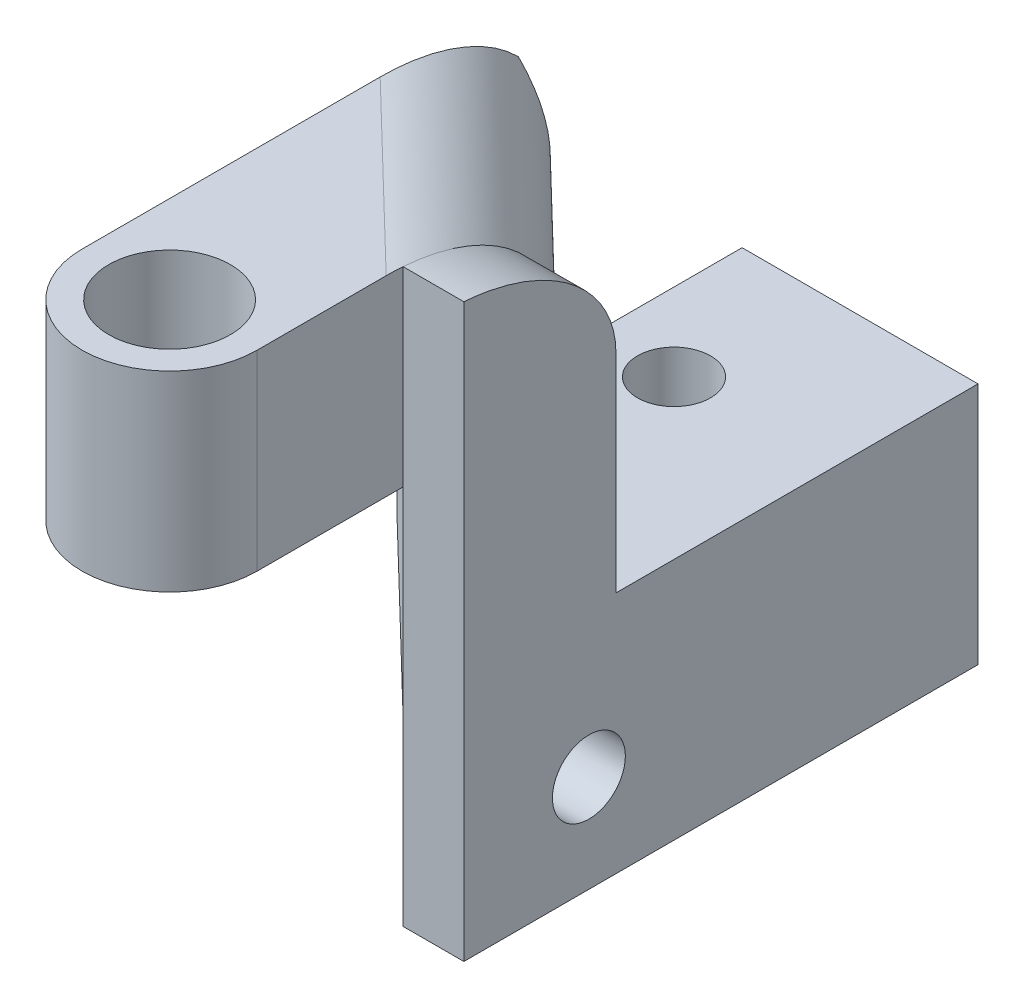
ISO-10303-21;
HEADER;
FILE_DESCRIPTION(('STEP AP214'),'2;1');
FILE_NAME('part.step','',(''),(''),'','','');
FILE_SCHEMA(('AUTOMOTIVE_DESIGN { 1 0 10303 214 1 1 1 1 }'));
ENDSEC;
DATA;
#1=APPLICATION_CONTEXT('core data for automotive mechanical design processes');
#2=APPLICATION_PROTOCOL_DEFINITION('international standard','automotive_design',2000,#1);
#3=PRODUCT_CONTEXT('',#1,'mechanical');
#4=PRODUCT('Part','Part','',(#3));
#5=PRODUCT_RELATED_PRODUCT_CATEGORY('part','',(#4));
#6=PRODUCT_DEFINITION_FORMATION('','',#4);
#7=PRODUCT_DEFINITION_CONTEXT('part definition',#1,'design');
#8=PRODUCT_DEFINITION('design','',#6,#7);
#9=PRODUCT_DEFINITION_SHAPE('','',#8);
#10=(LENGTH_UNIT() NAMED_UNIT(*) SI_UNIT(.MILLI.,.METRE.));
#11=(NAMED_UNIT(*) PLANE_ANGLE_UNIT() SI_UNIT($,.RADIAN.));
#12=(NAMED_UNIT(*) SI_UNIT($,.STERADIAN.) SOLID_ANGLE_UNIT());
#13=UNCERTAINTY_MEASURE_WITH_UNIT(LENGTH_MEASURE(1.E-05),#10,'distance_accuracy_value','');
#14=(GEOMETRIC_REPRESENTATION_CONTEXT(3) GLOBAL_UNCERTAINTY_ASSIGNED_CONTEXT((#13)) GLOBAL_UNIT_ASSIGNED_CONTEXT((#10,
#11,#12)) REPRESENTATION_CONTEXT('',''));
#15=CARTESIAN_POINT('',(0.,0.,0.));
#16=DIRECTION('',(0.,0.,1.));
#17=DIRECTION('',(1.,0.,0.));
#18=AXIS2_PLACEMENT_3D('',#15,#16,#17);
#19=CARTESIAN_POINT('',(4.73535338699276,2.5,-4.9036019787419));
#20=DIRECTION('',(0.694658370458993,0.,-0.719339800338655));
#21=DIRECTION('',(-0.719339800338655,0.,-0.694658370458993));
#22=AXIS2_PLACEMENT_3D('',#19,#20,#21);
#23=PLANE('',#22);
#24=DIRECTION('',(0.719339800338655,0.,0.694658370458993));
#25=VECTOR('',#24,1.);
#26=CARTESIAN_POINT('',(4.73535338699276,8.15,-4.9036019787419));
#27=LINE('',#26,#25);
#28=CARTESIAN_POINT('',(-3.6,8.15,-12.9529591786108));
#29=VERTEX_POINT('',#28);
#30=CARTESIAN_POINT('',(3.59999999999999,8.15,-6.));
#31=VERTEX_POINT('',#30);
#32=EDGE_CURVE('E182',#29,#31,#27,.T.);
#33=ORIENTED_EDGE('',*,*,#32,.F.);
#34=DIRECTION('',(0.,-1.,0.));
#35=VECTOR('',#34,1.);
#36=CARTESIAN_POINT('',(-3.6,2.5,-12.9529591786108));
#37=LINE('',#36,#35);
#38=CARTESIAN_POINT('',(-3.6,0.,-12.9529591786108));
#39=VERTEX_POINT('',#38);
#40=EDGE_CURVE('E232',#29,#39,#37,.T.);
#41=ORIENTED_EDGE('',*,*,#40,.T.);
#42=DIRECTION('',(0.719339800338655,0.,0.694658370458993));
#43=VECTOR('',#42,1.);
#44=CARTESIAN_POINT('',(4.73535338699276,0.,-4.9036019787419));
#45=LINE('',#44,#43);
#46=CARTESIAN_POINT('',(3.59999999999999,0.,-6.));
#47=VERTEX_POINT('',#46);
#48=EDGE_CURVE('E226',#39,#47,#45,.T.);
#49=ORIENTED_EDGE('',*,*,#48,.T.);
#50=DIRECTION('',(0.,-1.,0.));
#51=VECTOR('',#50,1.);
#52=CARTESIAN_POINT('',(3.59999999999999,2.5,-6.));
#53=LINE('',#52,#51);
#54=EDGE_CURVE('E216',#31,#47,#53,.T.);
#55=ORIENTED_EDGE('',*,*,#54,.F.);
#56=EDGE_LOOP('',(#33,#41,#49,#55));
#57=FACE_BOUND('',#56,.T.);
#58=ADVANCED_FACE('F41',(#57),#23,.F.);
#59=CARTESIAN_POINT('',(3.59999999999999,2.5,0.));
#60=DIRECTION('',(-1.,0.,0.));
#61=DIRECTION('',(0.,0.,1.));
#62=AXIS2_PLACEMENT_3D('',#59,#60,#61);
#63=PLANE('',#62);
#64=DIRECTION('',(0.,-1.,0.));
#65=VECTOR('',#64,1.);
#66=CARTESIAN_POINT('',(3.59999999999999,0.,-6.));
#67=LINE('',#66,#65);
#68=CARTESIAN_POINT('',(3.59999999999999,15.9949371855331,-6.));
#69=VERTEX_POINT('',#68);
#70=EDGE_CURVE('E57',#69,#31,#67,.T.);
#71=ORIENTED_EDGE('',*,*,#70,.F.);
#72=CARTESIAN_POINT('',(3.59999999999999,11.02,-5.30491820449167));
#73=DIRECTION('',(-1.,0.,0.));
#74=DIRECTION('',(0.,0.,1.));
#75=AXIS2_PLACEMENT_3D('',#72,#73,#74);
#76=ELLIPSE('',#75,6.95081795508336,5.);
#77=CARTESIAN_POINT('',(3.59999999999999,16.02,-5.30491820449167));
#78=VERTEX_POINT('',#77);
#79=EDGE_CURVE('E248',#69,#78,#76,.F.);
#80=ORIENTED_EDGE('',*,*,#79,.T.);
#81=DIRECTION('',(0.,0.,-1.));
#82=VECTOR('',#81,1.);
#83=CARTESIAN_POINT('',(3.59999999999999,16.02,0.));
#84=LINE('',#83,#82);
#85=CARTESIAN_POINT('',(3.59999999999999,16.02,0.));
#86=VERTEX_POINT('',#85);
#87=EDGE_CURVE('E202',#86,#78,#84,.T.);
#88=ORIENTED_EDGE('',*,*,#87,.F.);
#89=DIRECTION('',(0.,-1.,0.));
#90=VECTOR('',#89,1.);
#91=CARTESIAN_POINT('',(3.59999999999999,16.02,0.));
#92=LINE('',#91,#90);
#93=CARTESIAN_POINT('',(3.59999999999999,8.15,0.));
#94=VERTEX_POINT('',#93);
#95=EDGE_CURVE('E184',#86,#94,#92,.T.);
#96=ORIENTED_EDGE('',*,*,#95,.T.);
#97=DIRECTION('',(0.,0.,-1.));
#98=VECTOR('',#97,1.);
#99=CARTESIAN_POINT('',(3.59999999999999,8.15,0.));
#100=LINE('',#99,#98);
#101=EDGE_CURVE('E191',#94,#31,#100,.T.);
#102=ORIENTED_EDGE('',*,*,#101,.T.);
#103=EDGE_LOOP('',(#71,#80,#88,#96,#102));
#104=FACE_BOUND('',#103,.T.);
#105=ADVANCED_FACE('F360',(#104),#63,.F.);
#106=CARTESIAN_POINT('',(0.,2.5,-27.14));
#107=DIRECTION('',(0.,0.,1.));
#108=DIRECTION('',(1.,0.,0.));
#109=AXIS2_PLACEMENT_3D('',#106,#107,#108);
#110=PLANE('',#109);
#111=DIRECTION('',(-1.,0.,0.));
#112=VECTOR('',#111,1.);
#113=CARTESIAN_POINT('',(0.,0.,-27.14));
#114=LINE('',#113,#112);
#115=CARTESIAN_POINT('',(3.59999999999999,0.,-27.14));
#116=VERTEX_POINT('',#115);
#117=CARTESIAN_POINT('',(-3.6,0.,-27.14));
#118=VERTEX_POINT('',#117);
#119=EDGE_CURVE('E222',#116,#118,#114,.T.);
#120=ORIENTED_EDGE('',*,*,#119,.T.);
#121=DIRECTION('',(0.,-1.,0.));
#122=VECTOR('',#121,1.);
#123=CARTESIAN_POINT('',(-3.6,2.5,-27.14));
#124=LINE('',#123,#122);
#125=CARTESIAN_POINT('',(-3.6,2.5,-27.14));
#126=VERTEX_POINT('',#125);
#127=EDGE_CURVE('E240',#126,#118,#124,.T.);
#128=ORIENTED_EDGE('',*,*,#127,.F.);
#129=DIRECTION('',(-1.,0.,0.));
#130=VECTOR('',#129,1.);
#131=CARTESIAN_POINT('',(0.,2.5,-27.14));
#132=LINE('',#131,#130);
#133=CARTESIAN_POINT('',(6.09999999999999,2.5,-27.14));
#134=VERTEX_POINT('',#133);
#135=EDGE_CURVE('E149',#134,#126,#132,.T.);
#136=ORIENTED_EDGE('',*,*,#135,.F.);
#137=DIRECTION('',(0.,1.,0.));
#138=VECTOR('',#137,1.);
#139=CARTESIAN_POINT('',(6.09999999999999,0.,-27.14));
#140=LINE('',#139,#138);
#141=CARTESIAN_POINT('',(6.09999999999999,-7.5,-27.14));
#142=VERTEX_POINT('',#141);
#143=EDGE_CURVE('E145',#142,#134,#140,.T.);
#144=ORIENTED_EDGE('',*,*,#143,.F.);
#145=DIRECTION('',(-1.,0.,0.));
#146=VECTOR('',#145,1.);
#147=CARTESIAN_POINT('',(6.09999999999999,-7.5,-27.14));
#148=LINE('',#147,#146);
#149=CARTESIAN_POINT('',(3.59999999999999,-7.5,-27.14));
#150=VERTEX_POINT('',#149);
#151=EDGE_CURVE('E150',#142,#150,#148,.T.);
#152=ORIENTED_EDGE('',*,*,#151,.T.);
#153=DIRECTION('',(0.,1.,0.));
#154=VECTOR('',#153,1.);
#155=CARTESIAN_POINT('',(3.59999999999999,0.,-27.14));
#156=LINE('',#155,#154);
#157=EDGE_CURVE('E290',#150,#116,#156,.T.);
#158=ORIENTED_EDGE('',*,*,#157,.T.);
#159=EDGE_LOOP('',(#120,#128,#136,#144,#152,#158));
#160=FACE_BOUND('',#159,.T.);
#161=ADVANCED_FACE('F144',(#160),#110,.F.);
#162=CARTESIAN_POINT('',(-3.59999999999999,2.5,0.));
#163=DIRECTION('',(1.,0.,0.));
#164=DIRECTION('',(0.,0.,-1.));
#165=AXIS2_PLACEMENT_3D('',#162,#163,#164);
#166=PLANE('',#165);
#167=DIRECTION('',(0.,0.,1.));
#168=VECTOR('',#167,1.);
#169=CARTESIAN_POINT('',(-3.59999999999999,16.02,0.));
#170=LINE('',#169,#168);
#171=CARTESIAN_POINT('',(-3.59999999999999,16.02,-12.2578773831025));
#172=VERTEX_POINT('',#171);
#173=CARTESIAN_POINT('',(-3.59999999999999,16.02,0.));
#174=VERTEX_POINT('',#173);
#175=EDGE_CURVE('E203',#172,#174,#170,.T.);
#176=ORIENTED_EDGE('',*,*,#175,.F.);
#177=CARTESIAN_POINT('',(-3.59999999999999,11.02,-12.2578773831025));
#178=DIRECTION('',(1.,0.,0.));
#179=DIRECTION('',(0.,0.,1.));
#180=AXIS2_PLACEMENT_3D('',#177,#178,#179);
#181=ELLIPSE('',#180,6.95081795508336,5.);
#182=CARTESIAN_POINT('',(-3.59999999999999,13.899817646817,-17.94));
#183=VERTEX_POINT('',#182);
#184=EDGE_CURVE('E47',#172,#183,#181,.F.);
#185=ORIENTED_EDGE('',*,*,#184,.T.);
#186=DIRECTION('',(0.,-1.,0.));
#187=VECTOR('',#186,1.);
#188=CARTESIAN_POINT('',(-3.59999999999999,29.9628691451939,-17.94));
#189=LINE('',#188,#187);
#190=CARTESIAN_POINT('',(-3.59999999999999,2.5,-17.94));
#191=VERTEX_POINT('',#190);
#192=EDGE_CURVE('E205',#183,#191,#189,.T.);
#193=ORIENTED_EDGE('',*,*,#192,.T.);
#194=DIRECTION('',(0.,0.,1.));
#195=VECTOR('',#194,1.);
#196=CARTESIAN_POINT('',(-3.59999999999999,2.5,0.));
#197=LINE('',#196,#195);
#198=EDGE_CURVE('E212',#126,#191,#197,.T.);
#199=ORIENTED_EDGE('',*,*,#198,.F.);
#200=ORIENTED_EDGE('',*,*,#127,.T.);
#201=DIRECTION('',(0.,0.,1.));
#202=VECTOR('',#201,1.);
#203=CARTESIAN_POINT('',(-3.59999999999999,0.,0.));
#204=LINE('',#203,#202);
#205=EDGE_CURVE('E221',#118,#39,#204,.T.);
#206=ORIENTED_EDGE('',*,*,#205,.T.);
#207=ORIENTED_EDGE('',*,*,#40,.F.);
#208=DIRECTION('',(0.,0.,1.));
#209=VECTOR('',#208,1.);
#210=CARTESIAN_POINT('',(-3.59999999999999,8.15,0.));
#211=LINE('',#210,#209);
#212=CARTESIAN_POINT('',(-3.59999999999999,8.15,0.));
#213=VERTEX_POINT('',#212);
#214=EDGE_CURVE('E175',#29,#213,#211,.T.);
#215=ORIENTED_EDGE('',*,*,#214,.T.);
#216=DIRECTION('',(0.,-1.,0.));
#217=VECTOR('',#216,1.);
#218=CARTESIAN_POINT('',(-3.59999999999999,16.02,0.));
#219=LINE('',#218,#217);
#220=EDGE_CURVE('E200',#174,#213,#219,.T.);
#221=ORIENTED_EDGE('',*,*,#220,.F.);
#222=EDGE_LOOP('',(#176,#185,#193,#199,#200,#206,#207,#215,#221));
#223=FACE_BOUND('',#222,.T.);
#224=ADVANCED_FACE('F262',(#223),#166,.F.);
#225=CARTESIAN_POINT('',(-0.400000000000008,2.5,-21.14));
#226=DIRECTION('',(0.,-1.,0.));
#227=DIRECTION('',(0.,0.,-1.));
#228=AXIS2_PLACEMENT_3D('',#225,#226,#227);
#229=CYLINDRICAL_SURFACE('',#228,1.5);
#230=CARTESIAN_POINT('',(-0.400000000000008,2.5,-21.14));
#231=DIRECTION('',(0.,1.,0.));
#232=DIRECTION('',(0.,0.,1.));
#233=AXIS2_PLACEMENT_3D('',#230,#231,#232);
#234=CIRCLE('',#233,1.5);
#235=CARTESIAN_POINT('',(-0.400000000000008,2.5,-19.64));
#236=VERTEX_POINT('',#235);
#237=EDGE_CURVE('E220',#236,#236,#234,.T.);
#238=ORIENTED_EDGE('',*,*,#237,.T.);
#239=EDGE_LOOP('',(#238));
#240=FACE_BOUND('',#239,.T.);
#241=CARTESIAN_POINT('',(-0.400000000000008,0.,-21.14));
#242=DIRECTION('',(0.,1.,0.));
#243=DIRECTION('',(0.,0.,1.));
#244=AXIS2_PLACEMENT_3D('',#241,#242,#243);
#245=CIRCLE('',#244,1.5);
#246=CARTESIAN_POINT('',(-0.400000000000008,0.,-19.64));
#247=VERTEX_POINT('',#246);
#248=EDGE_CURVE('E213',#247,#247,#245,.T.);
#249=ORIENTED_EDGE('',*,*,#248,.F.);
#250=EDGE_LOOP('',(#249));
#251=FACE_BOUND('',#250,.T.);
#252=ADVANCED_FACE('F353',(#240,#251),#229,.F.);
#253=CARTESIAN_POINT('',(0.,2.5,0.));
#254=DIRECTION('',(0.,1.,0.));
#255=DIRECTION('',(0.,0.,1.));
#256=AXIS2_PLACEMENT_3D('',#253,#254,#255);
#257=PLANE('',#256);
#258=DIRECTION('',(-0.719339800338655,0.,-0.694658370458993));
#259=VECTOR('',#258,1.);
#260=CARTESIAN_POINT('',(7.86131605405823,2.5,-8.14063108026585));
#261=LINE('',#260,#259);
#262=CARTESIAN_POINT('',(3.59999999999999,2.5,-12.255736159575));
#263=VERTEX_POINT('',#262);
#264=CARTESIAN_POINT('',(-2.28622751834374,2.5,-17.94));
#265=VERTEX_POINT('',#264);
#266=EDGE_CURVE('E243',#263,#265,#261,.T.);
#267=ORIENTED_EDGE('',*,*,#266,.F.);
#268=DIRECTION('',(-1.,0.,0.));
#269=VECTOR('',#268,1.);
#270=CARTESIAN_POINT('',(6.09999999999999,2.5,-12.255736159575));
#271=LINE('',#270,#269);
#272=CARTESIAN_POINT('',(6.09999999999999,2.5,-12.255736159575));
#273=VERTEX_POINT('',#272);
#274=EDGE_CURVE('E169',#273,#263,#271,.T.);
#275=ORIENTED_EDGE('',*,*,#274,.F.);
#276=DIRECTION('',(0.,0.,1.));
#277=VECTOR('',#276,1.);
#278=CARTESIAN_POINT('',(6.09999999999999,2.5,0.));
#279=LINE('',#278,#277);
#280=EDGE_CURVE('E153',#134,#273,#279,.T.);
#281=ORIENTED_EDGE('',*,*,#280,.F.);
#282=ORIENTED_EDGE('',*,*,#135,.T.);
#283=ORIENTED_EDGE('',*,*,#198,.T.);
#284=DIRECTION('',(1.,0.,0.));
#285=VECTOR('',#284,1.);
#286=CARTESIAN_POINT('',(0.,2.5,-17.94));
#287=LINE('',#286,#285);
#288=EDGE_CURVE('E239',#191,#265,#287,.T.);
#289=ORIENTED_EDGE('',*,*,#288,.T.);
#290=EDGE_LOOP('',(#267,#275,#281,#282,#283,#289));
#291=FACE_BOUND('',#290,.T.);
#292=ORIENTED_EDGE('',*,*,#237,.F.);
#293=EDGE_LOOP('',(#292));
#294=FACE_BOUND('',#293,.T.);
#295=ADVANCED_FACE('F274',(#291,#294),#257,.T.);
#296=CARTESIAN_POINT('',(0.,0.,0.));
#297=DIRECTION('',(0.,1.,0.));
#298=DIRECTION('',(0.,0.,1.));
#299=AXIS2_PLACEMENT_3D('',#296,#297,#298);
#300=PLANE('',#299);
#301=ORIENTED_EDGE('',*,*,#119,.F.);
#302=DIRECTION('',(0.,0.,-1.));
#303=VECTOR('',#302,1.);
#304=CARTESIAN_POINT('',(3.59999999999999,0.,0.));
#305=LINE('',#304,#303);
#306=EDGE_CURVE('E210',#47,#116,#305,.T.);
#307=ORIENTED_EDGE('',*,*,#306,.F.);
#308=ORIENTED_EDGE('',*,*,#48,.F.);
#309=ORIENTED_EDGE('',*,*,#205,.F.);
#310=EDGE_LOOP('',(#301,#307,#308,#309));
#311=FACE_BOUND('',#310,.T.);
#312=ORIENTED_EDGE('',*,*,#248,.T.);
#313=EDGE_LOOP('',(#312));
#314=FACE_BOUND('',#313,.T.);
#315=ADVANCED_FACE('F282',(#311,#314),#300,.F.);
#316=CARTESIAN_POINT('',(7.86131605405823,29.9628691451939,-8.14063108026585));
#317=DIRECTION('',(0.694658370458993,0.,-0.719339800338655));
#318=DIRECTION('',(-0.719339800338655,0.,-0.694658370458993));
#319=AXIS2_PLACEMENT_3D('',#316,#317,#318);
#320=PLANE('',#319);
#321=DIRECTION('',(0.,-1.,0.));
#322=VECTOR('',#321,1.);
#323=CARTESIAN_POINT('',(-2.28622751834374,29.9628691451939,-17.94));
#324=LINE('',#323,#322);
#325=CARTESIAN_POINT('',(-2.28622751834374,11.02,-17.94));
#326=VERTEX_POINT('',#325);
#327=EDGE_CURVE('E206',#326,#265,#324,.T.);
#328=ORIENTED_EDGE('',*,*,#327,.F.);
#329=DIRECTION('',(0.719339800338655,0.,0.694658370458993));
#330=VECTOR('',#329,1.);
#331=CARTESIAN_POINT('',(7.86131605405823,11.02,-8.14063108026585));
#332=LINE('',#331,#330);
#333=CARTESIAN_POINT('',(3.59999999999999,11.02,-12.255736159575));
#334=VERTEX_POINT('',#333);
#335=EDGE_CURVE('E246',#326,#334,#332,.T.);
#336=ORIENTED_EDGE('',*,*,#335,.T.);
#337=DIRECTION('',(0.,-1.,0.));
#338=VECTOR('',#337,1.);
#339=CARTESIAN_POINT('',(3.59999999999999,29.9628691451939,-12.255736159575));
#340=LINE('',#339,#338);
#341=EDGE_CURVE('E196',#334,#263,#340,.T.);
#342=ORIENTED_EDGE('',*,*,#341,.T.);
#343=ORIENTED_EDGE('',*,*,#266,.T.);
#344=EDGE_LOOP('',(#328,#336,#342,#343));
#345=FACE_BOUND('',#344,.T.);
#346=ADVANCED_FACE('F270',(#345),#320,.T.);
#347=CARTESIAN_POINT('',(0.,29.9628691451939,-17.94));
#348=DIRECTION('',(0.,0.,1.));
#349=DIRECTION('',(1.,0.,0.));
#350=AXIS2_PLACEMENT_3D('',#347,#348,#349);
#351=PLANE('',#350);
#352=ORIENTED_EDGE('',*,*,#192,.F.);
#353=CARTESIAN_POINT('',(-9.48401021647242,11.02,-17.94));
#354=DIRECTION('',(0.,0.,1.));
#355=DIRECTION('',(1.,0.,0.));
#356=AXIS2_PLACEMENT_3D('',#353,#354,#355);
#357=ELLIPSE('',#356,7.19778269812867,5.);
#358=EDGE_CURVE('E11',#183,#326,#357,.F.);
#359=ORIENTED_EDGE('',*,*,#358,.T.);
#360=ORIENTED_EDGE('',*,*,#327,.T.);
#361=ORIENTED_EDGE('',*,*,#288,.F.);
#362=EDGE_LOOP('',(#352,#359,#360,#361));
#363=FACE_BOUND('',#362,.T.);
#364=ADVANCED_FACE('F268',(#363),#351,.F.);
#365=CARTESIAN_POINT('',(0.,16.02,0.));
#366=DIRECTION('',(0.,1.,0.));
#367=DIRECTION('',(0.,0.,1.));
#368=AXIS2_PLACEMENT_3D('',#365,#366,#367);
#369=PLANE('',#368);
#370=ORIENTED_EDGE('',*,*,#87,.T.);
#371=DIRECTION('',(0.719339800338655,0.,0.694658370458993));
#372=VECTOR('',#371,1.);
#373=CARTESIAN_POINT('',(4.38802420176326,16.02,-4.54393207857258));
#374=LINE('',#373,#372);
#375=EDGE_CURVE('E254',#78,#172,#374,.F.);
#376=ORIENTED_EDGE('',*,*,#375,.T.);
#377=ORIENTED_EDGE('',*,*,#175,.T.);
#378=CARTESIAN_POINT('',(0.,16.02,0.));
#379=DIRECTION('',(0.,1.,0.));
#380=DIRECTION('',(0.,0.,1.));
#381=AXIS2_PLACEMENT_3D('',#378,#379,#380);
#382=CIRCLE('',#381,3.59999999999999);
#383=EDGE_CURVE('E185',#174,#86,#382,.T.);
#384=ORIENTED_EDGE('',*,*,#383,.T.);
#385=EDGE_LOOP('',(#370,#376,#377,#384));
#386=FACE_BOUND('',#385,.T.);
#387=CARTESIAN_POINT('',(0.,16.02,0.));
#388=DIRECTION('',(0.,1.,0.));
#389=DIRECTION('',(0.,0.,1.));
#390=AXIS2_PLACEMENT_3D('',#387,#388,#389);
#391=CIRCLE('',#390,2.5);
#392=CARTESIAN_POINT('',(0.,16.02,2.5));
#393=VERTEX_POINT('',#392);
#394=EDGE_CURVE('E177',#393,#393,#391,.T.);
#395=ORIENTED_EDGE('',*,*,#394,.F.);
#396=EDGE_LOOP('',(#395));
#397=FACE_BOUND('',#396,.T.);
#398=ADVANCED_FACE('F256',(#386,#397),#369,.T.);
#399=CARTESIAN_POINT('',(0.,16.02,0.));
#400=DIRECTION('',(0.,-1.,0.));
#401=DIRECTION('',(0.,0.,-1.));
#402=AXIS2_PLACEMENT_3D('',#399,#400,#401);
#403=CYLINDRICAL_SURFACE('',#402,3.59999999999999);
#404=CARTESIAN_POINT('',(0.,8.15,0.));
#405=DIRECTION('',(0.,1.,0.));
#406=DIRECTION('',(0.,0.,1.));
#407=AXIS2_PLACEMENT_3D('',#404,#405,#406);
#408=CIRCLE('',#407,3.59999999999999);
#409=EDGE_CURVE('E186',#213,#94,#408,.T.);
#410=ORIENTED_EDGE('',*,*,#409,.T.);
#411=ORIENTED_EDGE('',*,*,#95,.F.);
#412=ORIENTED_EDGE('',*,*,#383,.F.);
#413=ORIENTED_EDGE('',*,*,#220,.T.);
#414=EDGE_LOOP('',(#410,#411,#412,#413));
#415=FACE_BOUND('',#414,.T.);
#416=ADVANCED_FACE('F337',(#415),#403,.T.);
#417=CARTESIAN_POINT('',(0.,16.02,0.));
#418=DIRECTION('',(0.,-1.,0.));
#419=DIRECTION('',(0.,0.,-1.));
#420=AXIS2_PLACEMENT_3D('',#417,#418,#419);
#421=CYLINDRICAL_SURFACE('',#420,2.5);
#422=ORIENTED_EDGE('',*,*,#394,.T.);
#423=EDGE_LOOP('',(#422));
#424=FACE_BOUND('',#423,.T.);
#425=CARTESIAN_POINT('',(0.,8.15,0.));
#426=DIRECTION('',(0.,1.,0.));
#427=DIRECTION('',(0.,0.,1.));
#428=AXIS2_PLACEMENT_3D('',#425,#426,#427);
#429=CIRCLE('',#428,2.5);
#430=CARTESIAN_POINT('',(0.,8.15,2.5));
#431=VERTEX_POINT('',#430);
#432=EDGE_CURVE('E166',#431,#431,#429,.T.);
#433=ORIENTED_EDGE('',*,*,#432,.F.);
#434=EDGE_LOOP('',(#433));
#435=FACE_BOUND('',#434,.T.);
#436=ADVANCED_FACE('F335',(#424,#435),#421,.F.);
#437=CARTESIAN_POINT('',(0.,8.15,0.));
#438=DIRECTION('',(0.,1.,0.));
#439=DIRECTION('',(0.,0.,1.));
#440=AXIS2_PLACEMENT_3D('',#437,#438,#439);
#441=PLANE('',#440);
#442=ORIENTED_EDGE('',*,*,#432,.T.);
#443=EDGE_LOOP('',(#442));
#444=FACE_BOUND('',#443,.T.);
#445=ORIENTED_EDGE('',*,*,#214,.F.);
#446=ORIENTED_EDGE('',*,*,#32,.T.);
#447=ORIENTED_EDGE('',*,*,#101,.F.);
#448=ORIENTED_EDGE('',*,*,#409,.F.);
#449=EDGE_LOOP('',(#445,#446,#447,#448));
#450=FACE_BOUND('',#449,.T.);
#451=ADVANCED_FACE('F333',(#444,#450),#441,.F.);
#452=CARTESIAN_POINT('',(4.38802420176326,11.02,-4.54393207857258));
#453=DIRECTION('',(0.719339800338655,0.,0.694658370458993));
#454=DIRECTION('',(0.694658370458993,0.,-0.719339800338655));
#455=AXIS2_PLACEMENT_3D('',#452,#453,#454);
#456=CYLINDRICAL_SURFACE('',#455,5.);
#457=ORIENTED_EDGE('',*,*,#184,.F.);
#458=ORIENTED_EDGE('',*,*,#375,.F.);
#459=ORIENTED_EDGE('',*,*,#79,.F.);
#460=EDGE_CURVE('E249',#334,#69,#76,.F.);
#461=ORIENTED_EDGE('',*,*,#460,.F.);
#462=ORIENTED_EDGE('',*,*,#335,.F.);
#463=ORIENTED_EDGE('',*,*,#358,.F.);
#464=EDGE_LOOP('',(#457,#458,#459,#461,#462,#463));
#465=FACE_BOUND('',#464,.T.);
#466=ADVANCED_FACE('F43',(#465),#456,.T.);
#467=CARTESIAN_POINT('',(3.59999999999999,0.,0.));
#468=DIRECTION('',(1.,0.,0.));
#469=DIRECTION('',(0.,0.,-1.));
#470=AXIS2_PLACEMENT_3D('',#467,#468,#469);
#471=PLANE('',#470);
#472=CARTESIAN_POINT('',(3.59999999999999,-3.5,-11.14));
#473=DIRECTION('',(1.,0.,0.));
#474=DIRECTION('',(0.,0.,-1.));
#475=AXIS2_PLACEMENT_3D('',#472,#473,#474);
#476=CIRCLE('',#475,1.5);
#477=CARTESIAN_POINT('',(3.59999999999999,-3.5,-12.64));
#478=VERTEX_POINT('',#477);
#479=EDGE_CURVE('E550',#478,#478,#476,.T.);
#480=ORIENTED_EDGE('',*,*,#479,.T.);
#481=EDGE_LOOP('',(#480));
#482=FACE_BOUND('',#481,.T.);
#483=CARTESIAN_POINT('',(3.59999999999999,-7.5,-6.));
#484=VERTEX_POINT('',#483);
#485=EDGE_CURVE('E288',#47,#484,#67,.T.);
#486=ORIENTED_EDGE('',*,*,#485,.F.);
#487=ORIENTED_EDGE('',*,*,#306,.T.);
#488=ORIENTED_EDGE('',*,*,#157,.F.);
#489=DIRECTION('',(0.,0.,-1.));
#490=VECTOR('',#489,1.);
#491=CARTESIAN_POINT('',(3.59999999999999,-7.5,0.));
#492=LINE('',#491,#490);
#493=EDGE_CURVE('E170',#484,#150,#492,.T.);
#494=ORIENTED_EDGE('',*,*,#493,.F.);
#495=EDGE_LOOP('',(#486,#487,#488,#494));
#496=FACE_BOUND('',#495,.T.);
#497=ADVANCED_FACE('F289',(#482,#496),#471,.F.);
#498=CARTESIAN_POINT('',(6.09999999999999,-7.5,0.));
#499=DIRECTION('',(0.,1.,0.));
#500=DIRECTION('',(0.,0.,1.));
#501=AXIS2_PLACEMENT_3D('',#498,#499,#500);
#502=PLANE('',#501);
#503=ORIENTED_EDGE('',*,*,#493,.T.);
#504=ORIENTED_EDGE('',*,*,#151,.F.);
#505=DIRECTION('',(0.,0.,-1.));
#506=VECTOR('',#505,1.);
#507=CARTESIAN_POINT('',(6.09999999999999,-7.5,0.));
#508=LINE('',#507,#506);
#509=CARTESIAN_POINT('',(6.09999999999999,-7.5,-6.));
#510=VERTEX_POINT('',#509);
#511=EDGE_CURVE('E154',#510,#142,#508,.T.);
#512=ORIENTED_EDGE('',*,*,#511,.F.);
#513=DIRECTION('',(-1.,0.,0.));
#514=VECTOR('',#513,1.);
#515=CARTESIAN_POINT('',(6.09999999999999,-7.5,-6.));
#516=LINE('',#515,#514);
#517=EDGE_CURVE('E297',#510,#484,#516,.T.);
#518=ORIENTED_EDGE('',*,*,#517,.T.);
#519=EDGE_LOOP('',(#503,#504,#512,#518));
#520=FACE_BOUND('',#519,.T.);
#521=ADVANCED_FACE('F164',(#520),#502,.F.);
#522=CARTESIAN_POINT('',(6.09999999999999,0.,-12.255736159575));
#523=DIRECTION('',(0.,0.,1.));
#524=DIRECTION('',(1.,0.,0.));
#525=AXIS2_PLACEMENT_3D('',#522,#523,#524);
#526=PLANE('',#525);
#527=ORIENTED_EDGE('',*,*,#341,.F.);
#528=DIRECTION('',(-1.,0.,0.));
#529=VECTOR('',#528,1.);
#530=CARTESIAN_POINT('',(6.09999999999999,11.02,-12.255736159575));
#531=LINE('',#530,#529);
#532=CARTESIAN_POINT('',(6.09999999999999,11.02,-12.255736159575));
#533=VERTEX_POINT('',#532);
#534=EDGE_CURVE('E174',#533,#334,#531,.T.);
#535=ORIENTED_EDGE('',*,*,#534,.F.);
#536=DIRECTION('',(0.,1.,0.));
#537=VECTOR('',#536,1.);
#538=CARTESIAN_POINT('',(6.09999999999999,0.,-12.255736159575));
#539=LINE('',#538,#537);
#540=EDGE_CURVE('E311',#273,#533,#539,.T.);
#541=ORIENTED_EDGE('',*,*,#540,.F.);
#542=ORIENTED_EDGE('',*,*,#274,.T.);
#543=EDGE_LOOP('',(#527,#535,#541,#542));
#544=FACE_BOUND('',#543,.T.);
#545=ADVANCED_FACE('F309',(#544),#526,.F.);
#546=CARTESIAN_POINT('',(6.09999999999999,11.02,-5.30491820449167));
#547=DIRECTION('',(1.,0.,0.));
#548=DIRECTION('',(0.,0.,1.));
#549=AXIS2_PLACEMENT_3D('',#546,#547,#548);
#550=ELLIPSE('',#549,6.95081795508336,5.);
#551=DIRECTION('',(-1.,0.,0.));
#552=VECTOR('',#551,1.);
#553=SURFACE_OF_LINEAR_EXTRUSION('',#550,#552);
#554=ORIENTED_EDGE('',*,*,#460,.T.);
#555=DIRECTION('',(-1.,0.,0.));
#556=VECTOR('',#555,1.);
#557=CARTESIAN_POINT('',(6.09999999999999,15.9949371855331,-6.));
#558=LINE('',#557,#556);
#559=CARTESIAN_POINT('',(6.09999999999999,15.9949371855331,-6.));
#560=VERTEX_POINT('',#559);
#561=EDGE_CURVE('E295',#560,#69,#558,.T.);
#562=ORIENTED_EDGE('',*,*,#561,.F.);
#563=EDGE_CURVE('E310',#533,#560,#550,.T.);
#564=ORIENTED_EDGE('',*,*,#563,.F.);
#565=ORIENTED_EDGE('',*,*,#534,.T.);
#566=EDGE_LOOP('',(#554,#562,#564,#565));
#567=FACE_BOUND('',#566,.T.);
#568=ADVANCED_FACE('F306',(#567),#553,.F.);
#569=CARTESIAN_POINT('',(6.09999999999999,-3.5,-11.14));
#570=DIRECTION('',(-1.,0.,0.));
#571=DIRECTION('',(0.,0.,1.));
#572=AXIS2_PLACEMENT_3D('',#569,#570,#571);
#573=CYLINDRICAL_SURFACE('',#572,1.5);
#574=CARTESIAN_POINT('',(6.09999999999999,-3.5,-11.14));
#575=DIRECTION('',(1.,0.,0.));
#576=DIRECTION('',(0.,0.,-1.));
#577=AXIS2_PLACEMENT_3D('',#574,#575,#576);
#578=CIRCLE('',#577,1.5);
#579=CARTESIAN_POINT('',(6.09999999999999,-3.5,-12.64));
#580=VERTEX_POINT('',#579);
#581=EDGE_CURVE('E161',#580,#580,#578,.T.);
#582=ORIENTED_EDGE('',*,*,#581,.T.);
#583=EDGE_LOOP('',(#582));
#584=FACE_BOUND('',#583,.T.);
#585=ORIENTED_EDGE('',*,*,#479,.F.);
#586=EDGE_LOOP('',(#585));
#587=FACE_BOUND('',#586,.T.);
#588=ADVANCED_FACE('F325',(#584,#587),#573,.F.);
#589=CARTESIAN_POINT('',(6.09999999999999,0.,-6.));
#590=DIRECTION('',(0.,0.,-1.));
#591=DIRECTION('',(0.,1.,0.));
#592=AXIS2_PLACEMENT_3D('',#589,#590,#591);
#593=PLANE('',#592);
#594=ORIENTED_EDGE('',*,*,#70,.T.);
#595=ORIENTED_EDGE('',*,*,#54,.T.);
#596=ORIENTED_EDGE('',*,*,#485,.T.);
#597=ORIENTED_EDGE('',*,*,#517,.F.);
#598=DIRECTION('',(0.,-1.,0.));
#599=VECTOR('',#598,1.);
#600=CARTESIAN_POINT('',(6.09999999999999,0.,-6.));
#601=LINE('',#600,#599);
#602=EDGE_CURVE('E160',#560,#510,#601,.T.);
#603=ORIENTED_EDGE('',*,*,#602,.F.);
#604=ORIENTED_EDGE('',*,*,#561,.T.);
#605=EDGE_LOOP('',(#594,#595,#596,#597,#603,#604));
#606=FACE_BOUND('',#605,.T.);
#607=ADVANCED_FACE('F293',(#606),#593,.F.);
#608=CARTESIAN_POINT('',(6.09999999999999,0.,0.));
#609=DIRECTION('',(1.,0.,0.));
#610=DIRECTION('',(0.,0.,-1.));
#611=AXIS2_PLACEMENT_3D('',#608,#609,#610);
#612=PLANE('',#611);
#613=ORIENTED_EDGE('',*,*,#581,.F.);
#614=EDGE_LOOP('',(#613));
#615=FACE_BOUND('',#614,.T.);
#616=ORIENTED_EDGE('',*,*,#511,.T.);
#617=ORIENTED_EDGE('',*,*,#143,.T.);
#618=ORIENTED_EDGE('',*,*,#280,.T.);
#619=ORIENTED_EDGE('',*,*,#540,.T.);
#620=ORIENTED_EDGE('',*,*,#563,.T.);
#621=ORIENTED_EDGE('',*,*,#602,.T.);
#622=EDGE_LOOP('',(#616,#617,#618,#619,#620,#621));
#623=FACE_BOUND('',#622,.T.);
#624=ADVANCED_FACE('F159',(#615,#623),#612,.T.);
#625=CLOSED_SHELL('',(#58,#105,#161,#224,#252,#295,#315,#346,#364,#398,#416,#436,#451,#466,#497,
#521,#545,#568,#588,#607,#624));
#626=MANIFOLD_SOLID_BREP('B2',#625);
#627=ADVANCED_BREP_SHAPE_REPRESENTATION('',(#18,#626),#14);
#628=SHAPE_DEFINITION_REPRESENTATION(#9,#627);
ENDSEC;
END-ISO-10303-21;
